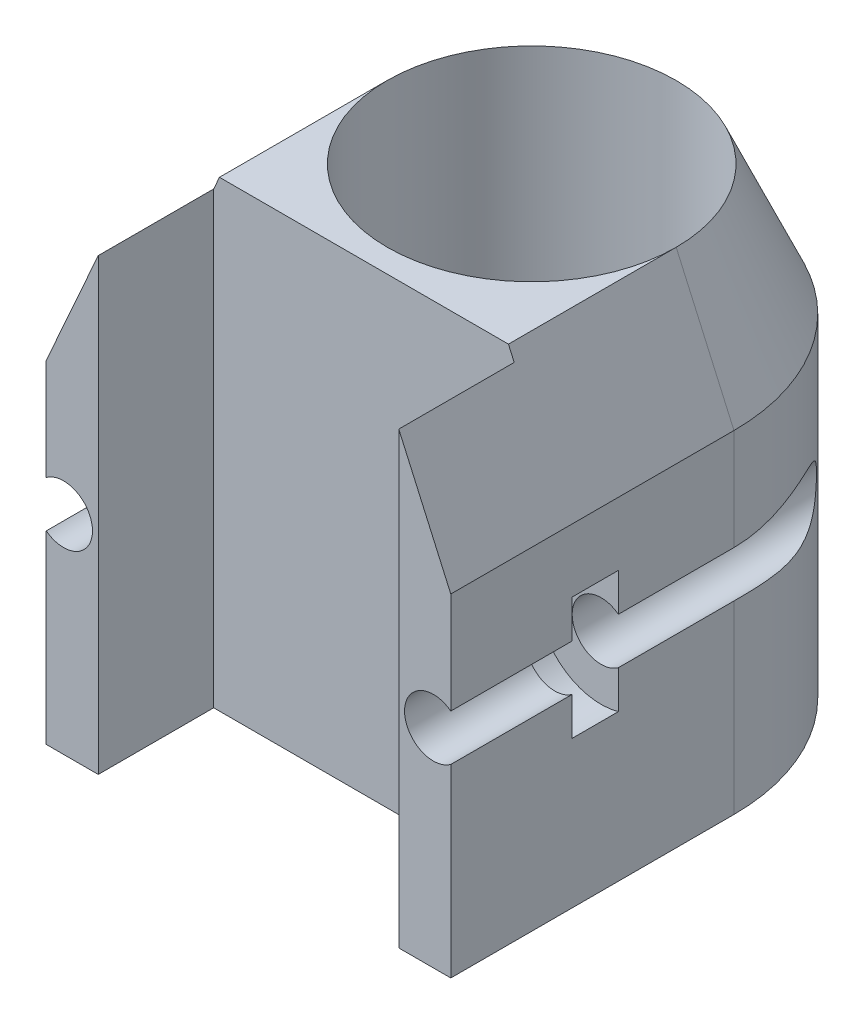
ISO-10303-21;
HEADER;
FILE_DESCRIPTION(('STEP AP214'),'2;1');
FILE_NAME('part.step','',(''),(''),'','','');
FILE_SCHEMA(('AUTOMOTIVE_DESIGN { 1 0 10303 214 1 1 1 1 }'));
ENDSEC;
DATA;
#1=APPLICATION_CONTEXT('core data for automotive mechanical design processes');
#2=APPLICATION_PROTOCOL_DEFINITION('international standard','automotive_design',2000,#1);
#3=PRODUCT_CONTEXT('',#1,'mechanical');
#4=PRODUCT('Part','Part','',(#3));
#5=PRODUCT_RELATED_PRODUCT_CATEGORY('part','',(#4));
#6=PRODUCT_DEFINITION_FORMATION('','',#4);
#7=PRODUCT_DEFINITION_CONTEXT('part definition',#1,'design');
#8=PRODUCT_DEFINITION('design','',#6,#7);
#9=PRODUCT_DEFINITION_SHAPE('','',#8);
#10=(LENGTH_UNIT() NAMED_UNIT(*) SI_UNIT(.MILLI.,.METRE.));
#11=(NAMED_UNIT(*) PLANE_ANGLE_UNIT() SI_UNIT($,.RADIAN.));
#12=(NAMED_UNIT(*) SI_UNIT($,.STERADIAN.) SOLID_ANGLE_UNIT());
#13=UNCERTAINTY_MEASURE_WITH_UNIT(LENGTH_MEASURE(1.E-05),#10,'distance_accuracy_value','');
#14=(GEOMETRIC_REPRESENTATION_CONTEXT(3) GLOBAL_UNCERTAINTY_ASSIGNED_CONTEXT((#13)) GLOBAL_UNIT_ASSIGNED_CONTEXT((#10,
#11,#12)) REPRESENTATION_CONTEXT('',''));
#15=CARTESIAN_POINT('',(0.,0.,0.));
#16=DIRECTION('',(0.,0.,1.));
#17=DIRECTION('',(1.,0.,0.));
#18=AXIS2_PLACEMENT_3D('',#15,#16,#17);
#19=CARTESIAN_POINT('',(17.5,0.,30.));
#20=DIRECTION('',(-1.,0.,0.));
#21=DIRECTION('',(0.,0.,1.));
#22=AXIS2_PLACEMENT_3D('',#19,#20,#21);
#23=PLANE('',#22);
#24=DIRECTION('',(0.,1.,0.));
#25=VECTOR('',#24,1.);
#26=CARTESIAN_POINT('',(17.5,0.,10.));
#27=LINE('',#26,#25);
#28=CARTESIAN_POINT('',(17.5,12.7084973778708,10.));
#29=VERTEX_POINT('',#28);
#30=CARTESIAN_POINT('',(17.5,16.,10.));
#31=VERTEX_POINT('',#30);
#32=EDGE_CURVE('E206',#29,#31,#27,.T.);
#33=ORIENTED_EDGE('',*,*,#32,.F.);
#34=DIRECTION('',(0.,0.,1.));
#35=VECTOR('',#34,1.);
#36=CARTESIAN_POINT('',(17.5,12.7084973778708,10.));
#37=LINE('',#36,#35);
#38=CARTESIAN_POINT('',(17.5,12.7084973778708,14.));
#39=VERTEX_POINT('',#38);
#40=EDGE_CURVE('E208',#39,#29,#37,.F.);
#41=ORIENTED_EDGE('',*,*,#40,.F.);
#42=DIRECTION('',(0.,1.,0.));
#43=VECTOR('',#42,1.);
#44=CARTESIAN_POINT('',(17.5,0.,14.));
#45=LINE('',#44,#43);
#46=CARTESIAN_POINT('',(17.5,16.,14.));
#47=VERTEX_POINT('',#46);
#48=EDGE_CURVE('E193',#39,#47,#45,.T.);
#49=ORIENTED_EDGE('',*,*,#48,.T.);
#50=DIRECTION('',(0.,0.,1.));
#51=VECTOR('',#50,1.);
#52=CARTESIAN_POINT('',(17.5,16.,-25.));
#53=LINE('',#52,#51);
#54=CARTESIAN_POINT('',(17.5,16.,24.5));
#55=VERTEX_POINT('',#54);
#56=EDGE_CURVE('E404',#47,#55,#53,.T.);
#57=ORIENTED_EDGE('',*,*,#56,.T.);
#58=DIRECTION('',(0.,-1.,0.));
#59=VECTOR('',#58,1.);
#60=CARTESIAN_POINT('',(17.5,0.,24.5));
#61=LINE('',#60,#59);
#62=CARTESIAN_POINT('',(17.5,0.,24.5));
#63=VERTEX_POINT('',#62);
#64=EDGE_CURVE('E235',#55,#63,#61,.T.);
#65=ORIENTED_EDGE('',*,*,#64,.T.);
#66=DIRECTION('',(0.,0.,-1.));
#67=VECTOR('',#66,1.);
#68=CARTESIAN_POINT('',(17.5,0.,30.));
#69=LINE('',#68,#67);
#70=CARTESIAN_POINT('',(17.5,0.,0.));
#71=VERTEX_POINT('',#70);
#72=EDGE_CURVE('E325',#63,#71,#69,.T.);
#73=ORIENTED_EDGE('',*,*,#72,.T.);
#74=DIRECTION('',(0.,1.,0.));
#75=VECTOR('',#74,1.);
#76=CARTESIAN_POINT('',(17.5,0.,0.));
#77=LINE('',#76,#75);
#78=CARTESIAN_POINT('',(17.5,16.,0.));
#79=VERTEX_POINT('',#78);
#80=EDGE_CURVE('E417',#71,#79,#77,.T.);
#81=ORIENTED_EDGE('',*,*,#80,.T.);
#82=EDGE_CURVE('E405',#79,#31,#53,.T.);
#83=ORIENTED_EDGE('',*,*,#82,.T.);
#84=EDGE_LOOP('',(#33,#41,#49,#57,#65,#73,#81,#83));
#85=FACE_BOUND('',#84,.T.);
#86=ADVANCED_FACE('F33',(#85),#23,.F.);
#87=DIRECTION('',(0.,1.,0.));
#88=VECTOR('',#87,1.);
#89=CARTESIAN_POINT('',(17.5,0.,10.));
#90=LINE('',#89,#88);
#91=CARTESIAN_POINT('',(17.5,20.,10.));
#92=VERTEX_POINT('',#91);
#93=CARTESIAN_POINT('',(17.5,23.2915026221292,10.));
#94=VERTEX_POINT('',#93);
#95=EDGE_CURVE('E201',#92,#94,#90,.T.);
#96=ORIENTED_EDGE('',*,*,#95,.F.);
#97=DIRECTION('',(0.,0.,1.));
#98=VECTOR('',#97,1.);
#99=CARTESIAN_POINT('',(17.5,20.,-25.));
#100=LINE('',#99,#98);
#101=CARTESIAN_POINT('',(17.5,20.,0.));
#102=VERTEX_POINT('',#101);
#103=EDGE_CURVE('E392',#92,#102,#100,.F.);
#104=ORIENTED_EDGE('',*,*,#103,.T.);
#105=CARTESIAN_POINT('',(17.5,28.7698161304786,0.));
#106=VERTEX_POINT('',#105);
#107=EDGE_CURVE('E414',#102,#106,#77,.T.);
#108=ORIENTED_EDGE('',*,*,#107,.T.);
#109=DIRECTION('',(0.,0.,1.));
#110=VECTOR('',#109,1.);
#111=CARTESIAN_POINT('',(17.5,28.7698161304786,30.));
#112=LINE('',#111,#110);
#113=CARTESIAN_POINT('',(17.5,28.7698161304786,24.5));
#114=VERTEX_POINT('',#113);
#115=EDGE_CURVE('E359',#106,#114,#112,.T.);
#116=ORIENTED_EDGE('',*,*,#115,.T.);
#117=DIRECTION('',(0.,-1.,0.));
#118=VECTOR('',#117,1.);
#119=CARTESIAN_POINT('',(17.5,0.,24.5));
#120=LINE('',#119,#118);
#121=CARTESIAN_POINT('',(17.5,20.,24.5));
#122=VERTEX_POINT('',#121);
#123=EDGE_CURVE('E230',#114,#122,#120,.T.);
#124=ORIENTED_EDGE('',*,*,#123,.T.);
#125=CARTESIAN_POINT('',(17.5,20.,14.));
#126=VERTEX_POINT('',#125);
#127=EDGE_CURVE('E199',#122,#126,#100,.F.);
#128=ORIENTED_EDGE('',*,*,#127,.T.);
#129=DIRECTION('',(0.,1.,0.));
#130=VECTOR('',#129,1.);
#131=CARTESIAN_POINT('',(17.5,0.,14.));
#132=LINE('',#131,#130);
#133=CARTESIAN_POINT('',(17.5,23.2915026221292,14.));
#134=VERTEX_POINT('',#133);
#135=EDGE_CURVE('E48',#126,#134,#132,.T.);
#136=ORIENTED_EDGE('',*,*,#135,.T.);
#137=DIRECTION('',(0.,0.,1.));
#138=VECTOR('',#137,1.);
#139=CARTESIAN_POINT('',(17.5,23.2915026221292,10.));
#140=LINE('',#139,#138);
#141=EDGE_CURVE('E11',#94,#134,#140,.T.);
#142=ORIENTED_EDGE('',*,*,#141,.F.);
#143=EDGE_LOOP('',(#96,#104,#108,#116,#124,#128,#136,#142));
#144=FACE_BOUND('',#143,.T.);
#145=ADVANCED_FACE('F196',(#144),#23,.F.);
#146=CARTESIAN_POINT('',(16.,18.,-25.));
#147=DIRECTION('',(0.,0.,1.));
#148=DIRECTION('',(1.,0.,0.));
#149=AXIS2_PLACEMENT_3D('',#146,#147,#148);
#150=CYLINDRICAL_SURFACE('',#149,2.5);
#151=CARTESIAN_POINT('',(16.,18.,10.));
#152=DIRECTION('',(0.,0.,1.));
#153=DIRECTION('',(1.,0.,0.));
#154=AXIS2_PLACEMENT_3D('',#151,#152,#153);
#155=CIRCLE('',#154,2.5);
#156=EDGE_CURVE('E41',#31,#92,#155,.F.);
#157=ORIENTED_EDGE('',*,*,#156,.F.);
#158=ORIENTED_EDGE('',*,*,#82,.F.);
#159=CARTESIAN_POINT('',(17.5,20.,0.));
#160=CARTESIAN_POINT('',(17.5000001349185,19.9999966583404,-0.104036701747004));
#161=CARTESIAN_POINT('',(17.4990722116674,20.0006962211482,-0.208069840767241));
#162=CARTESIAN_POINT('',(17.4953621135912,20.0034719912361,-0.416082588676481));
#163=CARTESIAN_POINT('',(17.492579977142,20.0055481700248,-0.520062198628784));
#164=CARTESIAN_POINT('',(17.4814573068199,20.0137962098175,-0.83179258471654));
#165=CARTESIAN_POINT('',(17.4703405093859,20.0219876088846,-1.03940004317038));
#166=CARTESIAN_POINT('',(17.4407607070393,20.0431679498784,-1.453592515381));
#167=CARTESIAN_POINT('',(17.4223061317233,20.0561513855178,-1.66017842792658));
#168=CARTESIAN_POINT('',(17.378105771415,20.0860332038702,-2.07229144767627));
#169=CARTESIAN_POINT('',(17.352359542209,20.1029318250882,-2.27781848959614));
#170=CARTESIAN_POINT('',(17.2932928182799,20.1397705834471,-2.68995548522975));
#171=CARTESIAN_POINT('',(17.2598879986332,20.1597437008973,-2.89655038308538));
#172=CARTESIAN_POINT('',(17.1857305541779,20.2013284029783,-3.30823506964464));
#173=CARTESIAN_POINT('',(17.1449778603509,20.2229400029982,-3.51332484419186));
#174=CARTESIAN_POINT('',(17.0117479682284,20.2882682504599,-4.12616155469434));
#175=CARTESIAN_POINT('',(16.908288643656,20.3324856611787,-4.53154776951602));
#176=CARTESIAN_POINT('',(16.7110070657937,20.3982174678684,-5.20301800335518));
#177=CARTESIAN_POINT('',(16.6251421221323,20.4224226966438,-5.47120680919474));
#178=CARTESIAN_POINT('',(16.4403328533076,20.4627347304597,-6.0037382732742));
#179=CARTESIAN_POINT('',(16.3413876027649,20.4788409621408,-6.26808065792502));
#180=CARTESIAN_POINT('',(16.1312794641152,20.4987675185581,-6.79047580903875));
#181=CARTESIAN_POINT('',(16.0201970165562,20.5026641943832,-7.04855760743155));
#182=CARTESIAN_POINT('',(15.7858892689778,20.4935741371551,-7.55873082248977));
#183=CARTESIAN_POINT('',(15.6626726774893,20.4805994320421,-7.81082637644844));
#184=CARTESIAN_POINT('',(15.4167176867694,20.4339314880849,-8.28489208156186));
#185=CARTESIAN_POINT('',(15.2949356355318,20.4022094258413,-8.5075306089698));
#186=CARTESIAN_POINT('',(15.1066107203799,20.3358685172449,-8.83494778832424));
#187=CARTESIAN_POINT('',(15.0427712018776,20.3105647015972,-8.94318964573963));
#188=CARTESIAN_POINT('',(14.9136548781851,20.2527461176608,-9.15688042350912));
#189=CARTESIAN_POINT('',(14.8483781337598,20.220231653708,-9.262329461528));
#190=CARTESIAN_POINT('',(14.7158979388157,20.1463746220114,-9.47142574198648));
#191=CARTESIAN_POINT('',(14.6486803425364,20.1049006579814,-9.5750181725665));
#192=CARTESIAN_POINT('',(14.5141222474948,20.012174864926,-9.77778382328739));
#193=CARTESIAN_POINT('',(14.4467817073161,19.9609186874695,-9.87695505382116));
#194=CARTESIAN_POINT('',(14.3135626830833,19.8475759950597,-10.0690368000539));
#195=CARTESIAN_POINT('',(14.2476782015196,19.7855504909686,-10.1619787014251));
#196=CARTESIAN_POINT('',(14.1187530310879,19.6491515398095,-10.3403523661797));
#197=CARTESIAN_POINT('',(14.0557082437364,19.5747966643985,-10.4257951338269));
#198=CARTESIAN_POINT('',(13.9403619067743,19.4199713290507,-10.5794456812424));
#199=CARTESIAN_POINT('',(13.8876063780179,19.3407100053055,-10.6485171363955));
#200=CARTESIAN_POINT('',(13.7886877183612,19.1703788537371,-10.7762989676296));
#201=CARTESIAN_POINT('',(13.7425252146353,19.0793079040702,-10.8350083581242));
#202=CARTESIAN_POINT('',(13.6593168727258,18.8846027050838,-10.9397258806229));
#203=CARTESIAN_POINT('',(13.6223810200207,18.7808370117646,-10.9855815107997));
#204=CARTESIAN_POINT('',(13.5617942431712,18.5637195390424,-11.0602937292252));
#205=CARTESIAN_POINT('',(13.5381216720758,18.4503837290013,-11.0891780201064));
#206=CARTESIAN_POINT('',(13.5088849691236,18.2337914174906,-11.1247690004805));
#207=CARTESIAN_POINT('',(13.5013267030213,18.131206757731,-11.1339198448082));
#208=CARTESIAN_POINT('',(13.4989970543622,17.9256921700422,-11.1367450978407));
#209=CARTESIAN_POINT('',(13.5042197902251,17.8227624226849,-11.130426625238));
#210=CARTESIAN_POINT('',(13.5254880258061,17.6328622559801,-11.1045662411206));
#211=CARTESIAN_POINT('',(13.5401236961017,17.5454857656249,-11.086745934486));
#212=CARTESIAN_POINT('',(13.5777060398346,17.3754342949404,-11.040687500343));
#213=CARTESIAN_POINT('',(13.6006544621609,17.2927603081912,-11.0124471805835));
#214=CARTESIAN_POINT('',(13.6620955495544,17.1074872222596,-10.9361891272966));
#215=CARTESIAN_POINT('',(13.7032167972818,17.0071803215394,-10.8847251639362));
#216=CARTESIAN_POINT('',(13.7942539996385,16.8186000553915,-10.7691220667369));
#217=CARTESIAN_POINT('',(13.8441863272334,16.7303496449201,-10.7049593082167));
#218=CARTESIAN_POINT('',(13.9725423664133,16.530671789883,-10.537237382894));
#219=CARTESIAN_POINT('',(14.0540060701347,16.4255182322951,-10.4285783366833));
#220=CARTESIAN_POINT('',(14.2225889193988,16.2373789299745,-10.1974774248338));
#221=CARTESIAN_POINT('',(14.3097187425488,16.1544366400306,-10.0750091978263));
#222=CARTESIAN_POINT('',(14.4699898820524,16.0206257373365,-9.84305044912465));
#223=CARTESIAN_POINT('',(14.5428705543899,15.9666774856238,-9.73511214483262));
#224=CARTESIAN_POINT('',(14.6883857185438,15.8699034649073,-9.51413866426798));
#225=CARTESIAN_POINT('',(14.7610200154238,15.8270850834616,-9.40110016080118));
#226=CARTESIAN_POINT('',(14.9050926145882,15.7510409081947,-9.17096923045799));
#227=CARTESIAN_POINT('',(14.9765295322297,15.7178255833414,-9.05387253397708));
#228=CARTESIAN_POINT('',(15.1174976789403,15.659700216836,-8.81648074232993));
#229=CARTESIAN_POINT('',(15.1870281757962,15.6347933263649,-8.6961844522729));
#230=CARTESIAN_POINT('',(15.3197345029758,15.5933873434762,-8.46008251038834));
#231=CARTESIAN_POINT('',(15.3830448294545,15.5764838271318,-8.3444220375553));
#232=CARTESIAN_POINT('',(15.5073049894279,15.5482032112337,-8.11116327783492));
#233=CARTESIAN_POINT('',(15.5682543865704,15.5368271288301,-7.99356463840249));
#234=CARTESIAN_POINT('',(15.7473429710268,15.509863210149,-7.63816321982876));
#235=CARTESIAN_POINT('',(15.8616586037815,15.501458018718,-7.39786858950536));
#236=CARTESIAN_POINT('',(16.0797792928233,15.4988849309453,-6.91102892797191));
#237=CARTESIAN_POINT('',(16.183523070867,15.5047956086261,-6.66445678478394));
#238=CARTESIAN_POINT('',(16.3794343976737,15.5269975825383,-6.16729293631431));
#239=CARTESIAN_POINT('',(16.4716036687891,15.5432873321083,-5.91670183534978));
#240=CARTESIAN_POINT('',(16.6363688796622,15.5810113767337,-5.43507071175561));
#241=CARTESIAN_POINT('',(16.7099828824276,15.6018422059095,-5.20432802575573));
#242=CARTESIAN_POINT('',(16.8475043584543,15.64692284989,-4.74027101487706));
#243=CARTESIAN_POINT('',(16.9114104974868,15.6711731337761,-4.50695634122738));
#244=CARTESIAN_POINT('',(17.0294961599903,15.72091179029,-4.0379166993228));
#245=CARTESIAN_POINT('',(17.0836719015325,15.7464006394436,-3.80219083136691));
#246=CARTESIAN_POINT('',(17.1822247753837,15.7965025191795,-3.32861031065927));
#247=CARTESIAN_POINT('',(17.2266021456003,15.8211155710142,-3.09075570973984));
#248=CARTESIAN_POINT('',(17.3048312870108,15.867058216798,-2.61714423710122));
#249=CARTESIAN_POINT('',(17.3388474864166,15.8884360595518,-2.38141933605158));
#250=CARTESIAN_POINT('',(17.3972606480938,15.9266251982784,-1.90842817504115));
#251=CARTESIAN_POINT('',(17.421658551437,15.9434369409568,-1.67116206818492));
#252=CARTESIAN_POINT('',(17.4607666075089,15.9710245124615,-1.19526690270277));
#253=CARTESIAN_POINT('',(17.4754689084798,15.981795448228,-0.956636896896107));
#254=CARTESIAN_POINT('',(17.4901821287962,15.9926660183677,-0.598199884218871));
#255=CARTESIAN_POINT('',(17.4938631654789,15.9954085926282,-0.47861034140202));
#256=CARTESIAN_POINT('',(17.49877226476,15.9990785581129,-0.23934902127463));
#257=CARTESIAN_POINT('',(17.5000002413907,16.0000058857215,-0.1196772412291));
#258=CARTESIAN_POINT('',(17.5,16.,0.));
#259=B_SPLINE_CURVE_WITH_KNOTS('',3,(#159,#160,#161,#162,#163,#164,#165,#166,#167,#168,#169,
#170,#171,#172,#173,#174,#175,#176,#177,#178,#179,#180,#181,#182,#183,#184,#185,#186,#187,#188,
#189,#190,#191,#192,#193,#194,#195,#196,#197,#198,#199,#200,#201,#202,#203,#204,#205,#206,#207,
#208,#209,#210,#211,#212,#213,#214,#215,#216,#217,#218,#219,#220,#221,#222,#223,#224,#225,#226,
#227,#228,#229,#230,#231,#232,#233,#234,#235,#236,#237,#238,#239,#240,#241,#242,#243,#244,#245,
#246,#247,#248,#249,#250,#251,#252,#253,#254,#255,#256,#257,#258),.UNSPECIFIED.,.F.,.F.,(4,2,2,
2,2,2,2,2,2,2,2,2,2,2,2,2,2,2,2,2,2,2,2,2,2,2,2,2,2,2,2,2,2,2,2,2,2,2,2,2,2,2,2,2,2,2,2,2,2,4),
(0.,0.312096657146084,0.624186855136378,1.24817204726987,1.87144247039534,2.49475087185122,
3.12528320581323,3.75582146265863,5.01667946406824,5.86424244105709,6.71186541186497,
7.5541771791628,8.39588877489218,9.16179472294351,9.54616330463849,9.93051566658765,
10.3209422325102,10.7115427584641,11.0999986323561,11.4878746060888,11.8397308120868,
12.1916204668315,12.5475236087374,12.9028441776861,13.2107729637197,13.5185600732784,
13.7884991632999,14.0584950778171,14.4165217730039,14.7752209059652,15.2876321200243,
15.8010386255903,16.2233618616991,16.6459647071821,17.0690265393981,17.4922486464145,
17.8908810264079,18.2895867343784,19.0873917984768,19.8895856056375,20.6916598999882,
21.4207042104739,22.1498486288209,22.8792758344541,23.6086853273998,24.3258307921385,
25.0429060726195,25.7605613490251,26.1195600133014,26.4785712584831),.UNSPECIFIED.);
#260=EDGE_CURVE('E395',#102,#79,#259,.T.);
#261=ORIENTED_EDGE('',*,*,#260,.F.);
#262=ORIENTED_EDGE('',*,*,#103,.F.);
#263=EDGE_LOOP('',(#157,#158,#261,#262));
#264=FACE_BOUND('',#263,.T.);
#265=ADVANCED_FACE('F304',(#264),#150,.F.);
#266=CARTESIAN_POINT('',(-17.5,0.,30.));
#267=DIRECTION('',(1.,0.,0.));
#268=DIRECTION('',(0.,0.,-1.));
#269=AXIS2_PLACEMENT_3D('',#266,#267,#268);
#270=PLANE('',#269);
#271=DIRECTION('',(0.,-1.,0.));
#272=VECTOR('',#271,1.);
#273=CARTESIAN_POINT('',(-17.5,0.,10.));
#274=LINE('',#273,#272);
#275=CARTESIAN_POINT('',(-17.5,23.2915026221292,10.));
#276=VERTEX_POINT('',#275);
#277=CARTESIAN_POINT('',(-17.5,20.,10.));
#278=VERTEX_POINT('',#277);
#279=EDGE_CURVE('E222',#276,#278,#274,.T.);
#280=ORIENTED_EDGE('',*,*,#279,.F.);
#281=DIRECTION('',(0.,0.,1.));
#282=VECTOR('',#281,1.);
#283=CARTESIAN_POINT('',(-17.5,23.2915026221292,10.));
#284=LINE('',#283,#282);
#285=CARTESIAN_POINT('',(-17.5,23.2915026221292,14.));
#286=VERTEX_POINT('',#285);
#287=EDGE_CURVE('E224',#276,#286,#284,.T.);
#288=ORIENTED_EDGE('',*,*,#287,.T.);
#289=DIRECTION('',(0.,-1.,0.));
#290=VECTOR('',#289,1.);
#291=CARTESIAN_POINT('',(-17.5,0.,14.));
#292=LINE('',#291,#290);
#293=CARTESIAN_POINT('',(-17.5,20.,14.));
#294=VERTEX_POINT('',#293);
#295=EDGE_CURVE('E217',#286,#294,#292,.T.);
#296=ORIENTED_EDGE('',*,*,#295,.T.);
#297=DIRECTION('',(0.,0.,1.));
#298=VECTOR('',#297,1.);
#299=CARTESIAN_POINT('',(-17.5,20.,-25.));
#300=LINE('',#299,#298);
#301=CARTESIAN_POINT('',(-17.5,20.,24.5));
#302=VERTEX_POINT('',#301);
#303=EDGE_CURVE('E270',#294,#302,#300,.T.);
#304=ORIENTED_EDGE('',*,*,#303,.T.);
#305=DIRECTION('',(0.,1.,0.));
#306=VECTOR('',#305,1.);
#307=CARTESIAN_POINT('',(-17.5,0.,24.5));
#308=LINE('',#307,#306);
#309=CARTESIAN_POINT('',(-17.5,28.7698161304786,24.5));
#310=VERTEX_POINT('',#309);
#311=EDGE_CURVE('E247',#302,#310,#308,.T.);
#312=ORIENTED_EDGE('',*,*,#311,.T.);
#313=DIRECTION('',(0.,0.,-1.));
#314=VECTOR('',#313,1.);
#315=CARTESIAN_POINT('',(-17.5,28.7698161304786,0.));
#316=LINE('',#315,#314);
#317=CARTESIAN_POINT('',(-17.5,28.7698161304786,0.));
#318=VERTEX_POINT('',#317);
#319=EDGE_CURVE('E364',#310,#318,#316,.T.);
#320=ORIENTED_EDGE('',*,*,#319,.T.);
#321=DIRECTION('',(0.,-1.,0.));
#322=VECTOR('',#321,1.);
#323=CARTESIAN_POINT('',(-17.5,0.,0.));
#324=LINE('',#323,#322);
#325=CARTESIAN_POINT('',(-17.5,20.,0.));
#326=VERTEX_POINT('',#325);
#327=EDGE_CURVE('E421',#318,#326,#324,.T.);
#328=ORIENTED_EDGE('',*,*,#327,.T.);
#329=EDGE_CURVE('E271',#326,#278,#300,.T.);
#330=ORIENTED_EDGE('',*,*,#329,.T.);
#331=EDGE_LOOP('',(#280,#288,#296,#304,#312,#320,#328,#330));
#332=FACE_BOUND('',#331,.T.);
#333=ADVANCED_FACE('F300',(#332),#270,.F.);
#334=DIRECTION('',(0.,-1.,0.));
#335=VECTOR('',#334,1.);
#336=CARTESIAN_POINT('',(-17.5,0.,10.));
#337=LINE('',#336,#335);
#338=CARTESIAN_POINT('',(-17.5,16.,10.));
#339=VERTEX_POINT('',#338);
#340=CARTESIAN_POINT('',(-17.5,12.7084973778708,10.));
#341=VERTEX_POINT('',#340);
#342=EDGE_CURVE('E220',#339,#341,#337,.T.);
#343=ORIENTED_EDGE('',*,*,#342,.F.);
#344=DIRECTION('',(0.,0.,1.));
#345=VECTOR('',#344,1.);
#346=CARTESIAN_POINT('',(-17.5,16.,-25.));
#347=LINE('',#346,#345);
#348=CARTESIAN_POINT('',(-17.5,16.,0.));
#349=VERTEX_POINT('',#348);
#350=EDGE_CURVE('E261',#339,#349,#347,.F.);
#351=ORIENTED_EDGE('',*,*,#350,.T.);
#352=CARTESIAN_POINT('',(-17.5,0.,0.));
#353=VERTEX_POINT('',#352);
#354=EDGE_CURVE('E420',#349,#353,#324,.T.);
#355=ORIENTED_EDGE('',*,*,#354,.T.);
#356=DIRECTION('',(0.,0.,-1.));
#357=VECTOR('',#356,1.);
#358=CARTESIAN_POINT('',(-17.5,0.,30.));
#359=LINE('',#358,#357);
#360=CARTESIAN_POINT('',(-17.5,0.,24.5));
#361=VERTEX_POINT('',#360);
#362=EDGE_CURVE('E331',#361,#353,#359,.T.);
#363=ORIENTED_EDGE('',*,*,#362,.F.);
#364=DIRECTION('',(0.,1.,0.));
#365=VECTOR('',#364,1.);
#366=CARTESIAN_POINT('',(-17.5,0.,24.5));
#367=LINE('',#366,#365);
#368=CARTESIAN_POINT('',(-17.5,16.,24.5));
#369=VERTEX_POINT('',#368);
#370=EDGE_CURVE('E253',#361,#369,#367,.T.);
#371=ORIENTED_EDGE('',*,*,#370,.T.);
#372=CARTESIAN_POINT('',(-17.5,16.,14.));
#373=VERTEX_POINT('',#372);
#374=EDGE_CURVE('E257',#369,#373,#347,.F.);
#375=ORIENTED_EDGE('',*,*,#374,.T.);
#376=DIRECTION('',(0.,-1.,0.));
#377=VECTOR('',#376,1.);
#378=CARTESIAN_POINT('',(-17.5,0.,14.));
#379=LINE('',#378,#377);
#380=CARTESIAN_POINT('',(-17.5,12.7084973778708,14.));
#381=VERTEX_POINT('',#380);
#382=EDGE_CURVE('E56',#373,#381,#379,.T.);
#383=ORIENTED_EDGE('',*,*,#382,.T.);
#384=DIRECTION('',(0.,0.,1.));
#385=VECTOR('',#384,1.);
#386=CARTESIAN_POINT('',(-17.5,12.7084973778708,10.));
#387=LINE('',#386,#385);
#388=EDGE_CURVE('E380',#381,#341,#387,.F.);
#389=ORIENTED_EDGE('',*,*,#388,.T.);
#390=EDGE_LOOP('',(#343,#351,#355,#363,#371,#375,#383,#389));
#391=FACE_BOUND('',#390,.T.);
#392=ADVANCED_FACE('F303',(#391),#270,.F.);
#393=CARTESIAN_POINT('',(-16.,18.,-25.));
#394=DIRECTION('',(0.,0.,1.));
#395=DIRECTION('',(1.,0.,0.));
#396=AXIS2_PLACEMENT_3D('',#393,#394,#395);
#397=CYLINDRICAL_SURFACE('',#396,2.5);
#398=CARTESIAN_POINT('',(-16.,18.,10.));
#399=DIRECTION('',(0.,0.,1.));
#400=DIRECTION('',(1.,0.,0.));
#401=AXIS2_PLACEMENT_3D('',#398,#399,#400);
#402=CIRCLE('',#401,2.5);
#403=EDGE_CURVE('E378',#278,#339,#402,.F.);
#404=ORIENTED_EDGE('',*,*,#403,.F.);
#405=ORIENTED_EDGE('',*,*,#329,.F.);
#406=CARTESIAN_POINT('',(-17.5,16.,0.));
#407=CARTESIAN_POINT('',(-17.5000001349185,16.0000033416596,-0.104036701747));
#408=CARTESIAN_POINT('',(-17.4990722116674,15.9993037788518,-0.208069840767237));
#409=CARTESIAN_POINT('',(-17.4953621135912,15.9965280087639,-0.416082588676478));
#410=CARTESIAN_POINT('',(-17.492579977142,15.9944518299752,-0.520062198628782));
#411=CARTESIAN_POINT('',(-17.4814573068199,15.9862037901825,-0.831792584716539));
#412=CARTESIAN_POINT('',(-17.4703405093859,15.9780123911154,-1.03940004317038));
#413=CARTESIAN_POINT('',(-17.4407607070393,15.9568320501216,-1.45359251538101));
#414=CARTESIAN_POINT('',(-17.4223061317233,15.9438486144822,-1.66017842792658));
#415=CARTESIAN_POINT('',(-17.378105771415,15.9139667961298,-2.07229144767627));
#416=CARTESIAN_POINT('',(-17.352359542209,15.8970681749118,-2.27781848959615));
#417=CARTESIAN_POINT('',(-17.2932928182799,15.8602294165529,-2.68995548522975));
#418=CARTESIAN_POINT('',(-17.2598879986332,15.8402562991027,-2.89655038308538));
#419=CARTESIAN_POINT('',(-17.1857305541779,15.7986715970217,-3.30823506964465));
#420=CARTESIAN_POINT('',(-17.1449778603509,15.7770599970018,-3.51332484419186));
#421=CARTESIAN_POINT('',(-17.0117479682284,15.7117317495401,-4.12616155469435));
#422=CARTESIAN_POINT('',(-16.908288643656,15.6675143388213,-4.53154776951602));
#423=CARTESIAN_POINT('',(-16.7110070657937,15.6017825321316,-5.20301800335519));
#424=CARTESIAN_POINT('',(-16.6251421221323,15.5775773033562,-5.47120680919474));
#425=CARTESIAN_POINT('',(-16.4403328533076,15.5372652695403,-6.0037382732742));
#426=CARTESIAN_POINT('',(-16.3413876027649,15.5211590378592,-6.26808065792502));
#427=CARTESIAN_POINT('',(-16.1312794641152,15.5012324814419,-6.79047580903874));
#428=CARTESIAN_POINT('',(-16.0201970165562,15.4973358056168,-7.04855760743154));
#429=CARTESIAN_POINT('',(-15.7858892689778,15.5064258628449,-7.55873082248976));
#430=CARTESIAN_POINT('',(-15.6626726774893,15.5194005679579,-7.81082637644842));
#431=CARTESIAN_POINT('',(-15.4167176867694,15.5660685119151,-8.28489208156185));
#432=CARTESIAN_POINT('',(-15.2949356355318,15.5977905741587,-8.50753060896978));
#433=CARTESIAN_POINT('',(-15.10661072038,15.6641314827551,-8.83494778832423));
#434=CARTESIAN_POINT('',(-15.0427712018776,15.6894352984028,-8.94318964573962));
#435=CARTESIAN_POINT('',(-14.9136548781851,15.7472538823392,-9.15688042350911));
#436=CARTESIAN_POINT('',(-14.8483781337598,15.7797683462921,-9.26232946152799));
#437=CARTESIAN_POINT('',(-14.7158979388157,15.8536253779886,-9.47142574198648));
#438=CARTESIAN_POINT('',(-14.6486803425364,15.8950993420187,-9.5750181725665));
#439=CARTESIAN_POINT('',(-14.5141222474948,15.9878251350741,-9.7777838232874));
#440=CARTESIAN_POINT('',(-14.4467817073161,16.0390813125305,-9.87695505382116));
#441=CARTESIAN_POINT('',(-14.3135626830833,16.1524240049403,-10.0690368000539));
#442=CARTESIAN_POINT('',(-14.2476782015196,16.2144495090314,-10.1619787014251));
#443=CARTESIAN_POINT('',(-14.1187530310879,16.3508484601905,-10.3403523661797));
#444=CARTESIAN_POINT('',(-14.0557082437364,16.4252033356015,-10.4257951338269));
#445=CARTESIAN_POINT('',(-13.9403619067743,16.5800286709494,-10.5794456812424));
#446=CARTESIAN_POINT('',(-13.8876063780179,16.6592899946945,-10.6485171363955));
#447=CARTESIAN_POINT('',(-13.7886877183612,16.8296211462629,-10.7762989676296));
#448=CARTESIAN_POINT('',(-13.7425252146353,16.9206920959298,-10.8350083581242));
#449=CARTESIAN_POINT('',(-13.6593168727258,17.1153972949162,-10.9397258806229));
#450=CARTESIAN_POINT('',(-13.6223810200207,17.2191629882354,-10.9855815107997));
#451=CARTESIAN_POINT('',(-13.5617942431712,17.4362804609576,-11.0602937292252));
#452=CARTESIAN_POINT('',(-13.5381216720758,17.5496162709987,-11.0891780201064));
#453=CARTESIAN_POINT('',(-13.5088849691236,17.7662085825094,-11.1247690004804));
#454=CARTESIAN_POINT('',(-13.5013267030213,17.868793242269,-11.1339198448081));
#455=CARTESIAN_POINT('',(-13.4989970543622,18.0743078299579,-11.1367450978407));
#456=CARTESIAN_POINT('',(-13.5042197902251,18.1772375773151,-11.130426625238));
#457=CARTESIAN_POINT('',(-13.5254880258061,18.3671377440199,-11.1045662411206));
#458=CARTESIAN_POINT('',(-13.5401236961017,18.4545142343751,-11.086745934486));
#459=CARTESIAN_POINT('',(-13.5777060398346,18.6245657050597,-11.040687500343));
#460=CARTESIAN_POINT('',(-13.6006544621609,18.7072396918088,-11.0124471805835));
#461=CARTESIAN_POINT('',(-13.6620955495544,18.8925127777404,-10.9361891272965));
#462=CARTESIAN_POINT('',(-13.7032167972818,18.9928196784606,-10.8847251639361));
#463=CARTESIAN_POINT('',(-13.7942539996385,19.1813999446085,-10.7691220667369));
#464=CARTESIAN_POINT('',(-13.8441863272335,19.26965035508,-10.7049593082166));
#465=CARTESIAN_POINT('',(-13.9725423664133,19.469328210117,-10.537237382894));
#466=CARTESIAN_POINT('',(-14.0540060701347,19.5744817677049,-10.4285783366833));
#467=CARTESIAN_POINT('',(-14.2225889193989,19.7626210700256,-10.1974774248337));
#468=CARTESIAN_POINT('',(-14.3097187425488,19.8455633599694,-10.0750091978262));
#469=CARTESIAN_POINT('',(-14.4699898820525,19.9793742626636,-9.84305044912461));
#470=CARTESIAN_POINT('',(-14.5428705543899,20.0333225143762,-9.73511214483258));
#471=CARTESIAN_POINT('',(-14.6883857185438,20.1300965350927,-9.51413866426793));
#472=CARTESIAN_POINT('',(-14.7610200154238,20.1729149165384,-9.40110016080113));
#473=CARTESIAN_POINT('',(-14.9050926145883,20.2489590918053,-9.17096923045794));
#474=CARTESIAN_POINT('',(-14.9765295322297,20.2821744166586,-9.05387253397703));
#475=CARTESIAN_POINT('',(-15.1174976789403,20.3402997831641,-8.81648074232988));
#476=CARTESIAN_POINT('',(-15.1870281757962,20.3652066736351,-8.69618445227285));
#477=CARTESIAN_POINT('',(-15.3197345029758,20.4066126565238,-8.46008251038828));
#478=CARTESIAN_POINT('',(-15.3830448294545,20.4235161728682,-8.34442203755524));
#479=CARTESIAN_POINT('',(-15.507304989428,20.4517967887663,-8.11116327783485));
#480=CARTESIAN_POINT('',(-15.5682543865704,20.46317287117,-7.99356463840242));
#481=CARTESIAN_POINT('',(-15.7473429710268,20.490136789851,-7.63816321982868));
#482=CARTESIAN_POINT('',(-15.8616586037816,20.4985419812821,-7.39786858950527));
#483=CARTESIAN_POINT('',(-16.0797792928234,20.5011150690547,-6.91102892797181));
#484=CARTESIAN_POINT('',(-16.1835230708671,20.4952043913739,-6.66445678478384));
#485=CARTESIAN_POINT('',(-16.3794343976737,20.4730024174617,-6.1672929363142));
#486=CARTESIAN_POINT('',(-16.4716036687892,20.4567126678917,-5.91670183534966));
#487=CARTESIAN_POINT('',(-16.6363688796622,20.4189886232663,-5.43507071175548));
#488=CARTESIAN_POINT('',(-16.7099828824276,20.3981577940905,-5.20432802575561));
#489=CARTESIAN_POINT('',(-16.8475043584543,20.35307715011,-4.74027101487696));
#490=CARTESIAN_POINT('',(-16.9114104974869,20.3288268662239,-4.50695634122727));
#491=CARTESIAN_POINT('',(-17.0294961599903,20.2790882097101,-4.03791669932271));
#492=CARTESIAN_POINT('',(-17.0836719015325,20.2535993605564,-3.80219083136682));
#493=CARTESIAN_POINT('',(-17.1822247753837,20.2034974808205,-3.32861031065919));
#494=CARTESIAN_POINT('',(-17.2266021456003,20.1788844289858,-3.09075570973976));
#495=CARTESIAN_POINT('',(-17.3048312870108,20.1329417832021,-2.61714423710115));
#496=CARTESIAN_POINT('',(-17.3388474864166,20.1115639404482,-2.38141933605152));
#497=CARTESIAN_POINT('',(-17.3972606480938,20.0733748017216,-1.9084281750411));
#498=CARTESIAN_POINT('',(-17.421658551437,20.0565630590432,-1.67116206818487));
#499=CARTESIAN_POINT('',(-17.4607666075089,20.0289754875385,-1.19526690270273));
#500=CARTESIAN_POINT('',(-17.4754689084798,20.018204551772,-0.95663689689608));
#501=CARTESIAN_POINT('',(-17.4901821287962,20.0073339816323,-0.598199884218852));
#502=CARTESIAN_POINT('',(-17.4938631654789,20.0045914073718,-0.478610341402004));
#503=CARTESIAN_POINT('',(-17.49877226476,20.0009214418871,-0.239349021274621));
#504=CARTESIAN_POINT('',(-17.5000002413907,19.9999941142785,-0.119677241229094));
#505=CARTESIAN_POINT('',(-17.5,20.,0.));
#506=B_SPLINE_CURVE_WITH_KNOTS('',3,(#406,#407,#408,#409,#410,#411,#412,#413,#414,#415,#416,
#417,#418,#419,#420,#421,#422,#423,#424,#425,#426,#427,#428,#429,#430,#431,#432,#433,#434,#435,
#436,#437,#438,#439,#440,#441,#442,#443,#444,#445,#446,#447,#448,#449,#450,#451,#452,#453,#454,
#455,#456,#457,#458,#459,#460,#461,#462,#463,#464,#465,#466,#467,#468,#469,#470,#471,#472,#473,
#474,#475,#476,#477,#478,#479,#480,#481,#482,#483,#484,#485,#486,#487,#488,#489,#490,#491,#492,
#493,#494,#495,#496,#497,#498,#499,#500,#501,#502,#503,#504,#505),.UNSPECIFIED.,.F.,.F.,(4,2,2,
2,2,2,2,2,2,2,2,2,2,2,2,2,2,2,2,2,2,2,2,2,2,2,2,2,2,2,2,2,2,2,2,2,2,2,2,2,2,2,2,2,2,2,2,2,2,4),
(0.,0.312096657146085,0.624186855136381,1.24817204726987,1.87144247039535,2.49475087185123,
3.12528320581324,3.75582146265864,5.01667946406825,5.86424244105709,6.71186541186496,
7.55417717916279,8.39588877489216,9.1617947229435,9.54616330463849,9.93051566658766,
10.3209422325102,10.7115427584641,11.0999986323562,11.4878746060888,11.8397308120868,
12.1916204668316,12.5475236087375,12.9028441776861,13.2107729637197,13.5185600732784,
13.7884991632999,14.0584950778171,14.4165217730039,14.7752209059652,15.2876321200243,
15.8010386255903,16.2233618616991,16.6459647071822,17.0690265393981,17.4922486464145,
17.890881026408,18.2895867343784,19.0873917984768,19.8895856056376,20.6916598999883,
21.420704210474,22.149848628821,22.8792758344541,23.6086853273999,24.3258307921385,
25.0429060726196,25.7605613490251,26.1195600133014,26.478571258483),.UNSPECIFIED.);
#507=EDGE_CURVE('E260',#349,#326,#506,.T.);
#508=ORIENTED_EDGE('',*,*,#507,.F.);
#509=ORIENTED_EDGE('',*,*,#350,.F.);
#510=EDGE_LOOP('',(#404,#405,#508,#509));
#511=FACE_BOUND('',#510,.T.);
#512=ADVANCED_FACE('F285',(#511),#397,.F.);
#513=CARTESIAN_POINT('',(0.,40.,0.));
#514=DIRECTION('',(0.,1.,0.));
#515=DIRECTION('',(0.,0.,1.));
#516=AXIS2_PLACEMENT_3D('',#513,#514,#515);
#517=PLANE('',#516);
#518=DIRECTION('',(-1.,0.,0.));
#519=VECTOR('',#518,1.);
#520=CARTESIAN_POINT('',(-13.,40.,14.512798853972));
#521=LINE('',#520,#519);
#522=CARTESIAN_POINT('',(12.4999999999999,40.,14.512798853972));
#523=VERTEX_POINT('',#522);
#524=CARTESIAN_POINT('',(-12.4999999999999,40.,14.512798853972));
#525=VERTEX_POINT('',#524);
#526=EDGE_CURVE('E407',#523,#525,#521,.T.);
#527=ORIENTED_EDGE('',*,*,#526,.F.);
#528=DIRECTION('',(0.,0.,-1.));
#529=VECTOR('',#528,1.);
#530=CARTESIAN_POINT('',(12.4999999999999,40.,0.));
#531=LINE('',#530,#529);
#532=CARTESIAN_POINT('',(12.5,40.,0.));
#533=VERTEX_POINT('',#532);
#534=EDGE_CURVE('E351',#523,#533,#531,.T.);
#535=ORIENTED_EDGE('',*,*,#534,.T.);
#536=CARTESIAN_POINT('',(0.,40.,0.));
#537=DIRECTION('',(0.,1.,0.));
#538=DIRECTION('',(0.,0.,1.));
#539=AXIS2_PLACEMENT_3D('',#536,#537,#538);
#540=CIRCLE('',#539,12.5);
#541=CARTESIAN_POINT('',(-12.4999999999999,40.,0.));
#542=VERTEX_POINT('',#541);
#543=EDGE_CURVE('E330',#542,#533,#540,.T.);
#544=ORIENTED_EDGE('',*,*,#543,.F.);
#545=DIRECTION('',(0.,0.,1.));
#546=VECTOR('',#545,1.);
#547=CARTESIAN_POINT('',(-12.4999999999999,40.,30.));
#548=LINE('',#547,#546);
#549=EDGE_CURVE('E349',#542,#525,#548,.T.);
#550=ORIENTED_EDGE('',*,*,#549,.T.);
#551=EDGE_LOOP('',(#527,#535,#544,#550));
#552=FACE_BOUND('',#551,.T.);
#553=ADVANCED_FACE('F312',(#552),#517,.T.);
#554=CARTESIAN_POINT('',(0.,0.,0.));
#555=DIRECTION('',(0.,1.,0.));
#556=DIRECTION('',(0.,0.,1.));
#557=AXIS2_PLACEMENT_3D('',#554,#555,#556);
#558=PLANE('',#557);
#559=ORIENTED_EDGE('',*,*,#72,.F.);
#560=DIRECTION('',(-1.,0.,0.));
#561=VECTOR('',#560,1.);
#562=CARTESIAN_POINT('',(0.,0.,24.5));
#563=LINE('',#562,#561);
#564=CARTESIAN_POINT('',(13.,0.,24.5));
#565=VERTEX_POINT('',#564);
#566=EDGE_CURVE('E232',#63,#565,#563,.T.);
#567=ORIENTED_EDGE('',*,*,#566,.T.);
#568=DIRECTION('',(0.,0.,-1.));
#569=VECTOR('',#568,1.);
#570=CARTESIAN_POINT('',(13.,0.,0.));
#571=LINE('',#570,#569);
#572=CARTESIAN_POINT('',(13.,0.,14.512798853972));
#573=VERTEX_POINT('',#572);
#574=EDGE_CURVE('E347',#565,#573,#571,.T.);
#575=ORIENTED_EDGE('',*,*,#574,.T.);
#576=DIRECTION('',(-1.,0.,0.));
#577=VECTOR('',#576,1.);
#578=CARTESIAN_POINT('',(0.,0.,14.512798853972));
#579=LINE('',#578,#577);
#580=CARTESIAN_POINT('',(-13.,0.,14.512798853972));
#581=VERTEX_POINT('',#580);
#582=EDGE_CURVE('E341',#573,#581,#579,.T.);
#583=ORIENTED_EDGE('',*,*,#582,.T.);
#584=DIRECTION('',(0.,0.,1.));
#585=VECTOR('',#584,1.);
#586=CARTESIAN_POINT('',(-13.,0.,0.));
#587=LINE('',#586,#585);
#588=CARTESIAN_POINT('',(-13.,0.,24.5));
#589=VERTEX_POINT('',#588);
#590=EDGE_CURVE('E344',#581,#589,#587,.T.);
#591=ORIENTED_EDGE('',*,*,#590,.T.);
#592=EDGE_CURVE('E236',#589,#361,#563,.T.);
#593=ORIENTED_EDGE('',*,*,#592,.T.);
#594=ORIENTED_EDGE('',*,*,#362,.T.);
#595=CARTESIAN_POINT('',(0.,0.,0.));
#596=DIRECTION('',(0.,1.,0.));
#597=DIRECTION('',(0.,0.,1.));
#598=AXIS2_PLACEMENT_3D('',#595,#596,#597);
#599=CIRCLE('',#598,17.5);
#600=EDGE_CURVE('E338',#71,#353,#599,.T.);
#601=ORIENTED_EDGE('',*,*,#600,.F.);
#602=EDGE_LOOP('',(#559,#567,#575,#583,#591,#593,#594,#601));
#603=FACE_BOUND('',#602,.T.);
#604=CARTESIAN_POINT('',(0.,0.,0.));
#605=DIRECTION('',(0.,1.,0.));
#606=DIRECTION('',(0.,0.,1.));
#607=AXIS2_PLACEMENT_3D('',#604,#605,#606);
#608=CIRCLE('',#607,12.5);
#609=CARTESIAN_POINT('',(0.,0.,12.5));
#610=VERTEX_POINT('',#609);
#611=EDGE_CURVE('E328',#610,#610,#608,.T.);
#612=ORIENTED_EDGE('',*,*,#611,.T.);
#613=EDGE_LOOP('',(#612));
#614=FACE_BOUND('',#613,.T.);
#615=ADVANCED_FACE('F314',(#603,#614),#558,.F.);
#616=CARTESIAN_POINT('',(0.,40.,0.));
#617=DIRECTION('',(0.,-1.,0.));
#618=DIRECTION('',(0.,0.,-1.));
#619=AXIS2_PLACEMENT_3D('',#616,#617,#618);
#620=CYLINDRICAL_SURFACE('',#619,17.5);
#621=ORIENTED_EDGE('',*,*,#327,.F.);
#622=CARTESIAN_POINT('',(0.,28.7698161304786,0.));
#623=DIRECTION('',(0.,1.,0.));
#624=DIRECTION('',(0.,0.,1.));
#625=AXIS2_PLACEMENT_3D('',#622,#623,#624);
#626=CIRCLE('',#625,17.5);
#627=EDGE_CURVE('E362',#318,#106,#626,.F.);
#628=ORIENTED_EDGE('',*,*,#627,.T.);
#629=ORIENTED_EDGE('',*,*,#107,.F.);
#630=ORIENTED_EDGE('',*,*,#260,.T.);
#631=ORIENTED_EDGE('',*,*,#80,.F.);
#632=ORIENTED_EDGE('',*,*,#600,.T.);
#633=ORIENTED_EDGE('',*,*,#354,.F.);
#634=ORIENTED_EDGE('',*,*,#507,.T.);
#635=EDGE_LOOP('',(#621,#628,#629,#630,#631,#632,#633,#634));
#636=FACE_BOUND('',#635,.T.);
#637=ADVANCED_FACE('F273',(#636),#620,.T.);
#638=CARTESIAN_POINT('',(0.,40.,0.));
#639=DIRECTION('',(0.,-1.,0.));
#640=DIRECTION('',(0.,0.,-1.));
#641=AXIS2_PLACEMENT_3D('',#638,#639,#640);
#642=CYLINDRICAL_SURFACE('',#641,12.5);
#643=EDGE_CURVE('E334',#533,#542,#540,.T.);
#644=ORIENTED_EDGE('',*,*,#643,.T.);
#645=ORIENTED_EDGE('',*,*,#543,.T.);
#646=EDGE_LOOP('',(#644,#645));
#647=FACE_BOUND('',#646,.T.);
#648=ORIENTED_EDGE('',*,*,#611,.F.);
#649=EDGE_LOOP('',(#648));
#650=FACE_BOUND('',#649,.T.);
#651=ADVANCED_FACE('F298',(#647,#650),#642,.F.);
#652=CARTESIAN_POINT('',(13.,-15.,24.512798853972));
#653=DIRECTION('',(1.,0.,0.));
#654=DIRECTION('',(0.,0.,-1.));
#655=AXIS2_PLACEMENT_3D('',#652,#653,#654);
#656=PLANE('',#655);
#657=ORIENTED_EDGE('',*,*,#574,.F.);
#658=DIRECTION('',(0.,1.,0.));
#659=VECTOR('',#658,1.);
#660=CARTESIAN_POINT('',(13.,-15.,24.5));
#661=LINE('',#660,#659);
#662=CARTESIAN_POINT('',(13.,38.8769816130477,24.5));
#663=VERTEX_POINT('',#662);
#664=EDGE_CURVE('E227',#565,#663,#661,.T.);
#665=ORIENTED_EDGE('',*,*,#664,.T.);
#666=DIRECTION('',(0.,0.,-1.));
#667=VECTOR('',#666,1.);
#668=CARTESIAN_POINT('',(13.,38.8769816130477,0.));
#669=LINE('',#668,#667);
#670=CARTESIAN_POINT('',(13.,38.8769816130477,14.512798853972));
#671=VERTEX_POINT('',#670);
#672=EDGE_CURVE('E353',#663,#671,#669,.T.);
#673=ORIENTED_EDGE('',*,*,#672,.T.);
#674=DIRECTION('',(0.,1.,0.));
#675=VECTOR('',#674,1.);
#676=CARTESIAN_POINT('',(13.,-15.,14.512798853972));
#677=LINE('',#676,#675);
#678=EDGE_CURVE('E410',#573,#671,#677,.T.);
#679=ORIENTED_EDGE('',*,*,#678,.F.);
#680=EDGE_LOOP('',(#657,#665,#673,#679));
#681=FACE_BOUND('',#680,.T.);
#682=ADVANCED_FACE('F291',(#681),#656,.F.);
#683=CARTESIAN_POINT('',(-13.,-15.,24.512798853972));
#684=DIRECTION('',(-1.,0.,0.));
#685=DIRECTION('',(0.,0.,1.));
#686=AXIS2_PLACEMENT_3D('',#683,#684,#685);
#687=PLANE('',#686);
#688=DIRECTION('',(0.,0.,1.));
#689=VECTOR('',#688,1.);
#690=CARTESIAN_POINT('',(-13.,38.8769816130477,30.));
#691=LINE('',#690,#689);
#692=CARTESIAN_POINT('',(-13.,38.8769816130477,14.512798853972));
#693=VERTEX_POINT('',#692);
#694=CARTESIAN_POINT('',(-13.,38.8769816130477,24.5));
#695=VERTEX_POINT('',#694);
#696=EDGE_CURVE('E366',#693,#695,#691,.T.);
#697=ORIENTED_EDGE('',*,*,#696,.T.);
#698=DIRECTION('',(0.,-1.,0.));
#699=VECTOR('',#698,1.);
#700=CARTESIAN_POINT('',(-13.,-15.,24.5));
#701=LINE('',#700,#699);
#702=EDGE_CURVE('E244',#695,#589,#701,.T.);
#703=ORIENTED_EDGE('',*,*,#702,.T.);
#704=ORIENTED_EDGE('',*,*,#590,.F.);
#705=DIRECTION('',(0.,1.,0.));
#706=VECTOR('',#705,1.);
#707=CARTESIAN_POINT('',(-13.,-15.,14.512798853972));
#708=LINE('',#707,#706);
#709=EDGE_CURVE('E411',#581,#693,#708,.T.);
#710=ORIENTED_EDGE('',*,*,#709,.T.);
#711=EDGE_LOOP('',(#697,#703,#704,#710));
#712=FACE_BOUND('',#711,.T.);
#713=ADVANCED_FACE('F288',(#712),#687,.F.);
#714=CARTESIAN_POINT('',(-13.,-15.,14.512798853972));
#715=DIRECTION('',(0.,0.,-1.));
#716=DIRECTION('',(-1.,0.,0.));
#717=AXIS2_PLACEMENT_3D('',#714,#715,#716);
#718=PLANE('',#717);
#719=ORIENTED_EDGE('',*,*,#678,.T.);
#720=DIRECTION('',(-0.406736643075797,0.913545457642602,0.));
#721=VECTOR('',#720,1.);
#722=CARTESIAN_POINT('',(12.4999999999999,40.,14.512798853972));
#723=LINE('',#722,#721);
#724=EDGE_CURVE('E357',#671,#523,#723,.T.);
#725=ORIENTED_EDGE('',*,*,#724,.T.);
#726=ORIENTED_EDGE('',*,*,#526,.T.);
#727=DIRECTION('',(-0.406736643075797,-0.913545457642602,0.));
#728=VECTOR('',#727,1.);
#729=CARTESIAN_POINT('',(-17.5,28.7698161304786,14.512798853972));
#730=LINE('',#729,#728);
#731=EDGE_CURVE('E355',#525,#693,#730,.T.);
#732=ORIENTED_EDGE('',*,*,#731,.T.);
#733=ORIENTED_EDGE('',*,*,#709,.F.);
#734=ORIENTED_EDGE('',*,*,#582,.F.);
#735=EDGE_LOOP('',(#719,#725,#726,#732,#733,#734));
#736=FACE_BOUND('',#735,.T.);
#737=ADVANCED_FACE('F283',(#736),#718,.F.);
#738=ORIENTED_EDGE('',*,*,#303,.F.);
#739=CARTESIAN_POINT('',(-16.,18.,14.));
#740=DIRECTION('',(0.,0.,1.));
#741=DIRECTION('',(1.,0.,0.));
#742=AXIS2_PLACEMENT_3D('',#739,#740,#741);
#743=CIRCLE('',#742,2.5);
#744=EDGE_CURVE('E376',#294,#373,#743,.F.);
#745=ORIENTED_EDGE('',*,*,#744,.T.);
#746=ORIENTED_EDGE('',*,*,#374,.F.);
#747=CARTESIAN_POINT('',(-16.,18.,24.5));
#748=DIRECTION('',(0.,0.,-1.));
#749=DIRECTION('',(-1.,0.,0.));
#750=AXIS2_PLACEMENT_3D('',#747,#748,#749);
#751=CIRCLE('',#750,2.5);
#752=EDGE_CURVE('E250',#369,#302,#751,.F.);
#753=ORIENTED_EDGE('',*,*,#752,.T.);
#754=EDGE_LOOP('',(#738,#745,#746,#753));
#755=FACE_BOUND('',#754,.T.);
#756=ADVANCED_FACE('F277',(#755),#397,.F.);
#757=ORIENTED_EDGE('',*,*,#56,.F.);
#758=CARTESIAN_POINT('',(16.,18.,14.));
#759=DIRECTION('',(0.,0.,1.));
#760=DIRECTION('',(1.,0.,0.));
#761=AXIS2_PLACEMENT_3D('',#758,#759,#760);
#762=CIRCLE('',#761,2.5);
#763=EDGE_CURVE('E383',#47,#126,#762,.F.);
#764=ORIENTED_EDGE('',*,*,#763,.T.);
#765=ORIENTED_EDGE('',*,*,#127,.F.);
#766=CARTESIAN_POINT('',(16.,18.,24.5));
#767=DIRECTION('',(0.,0.,-1.));
#768=DIRECTION('',(-1.,0.,0.));
#769=AXIS2_PLACEMENT_3D('',#766,#767,#768);
#770=CIRCLE('',#769,2.5);
#771=EDGE_CURVE('E239',#122,#55,#770,.F.);
#772=ORIENTED_EDGE('',*,*,#771,.T.);
#773=EDGE_LOOP('',(#757,#764,#765,#772));
#774=FACE_BOUND('',#773,.T.);
#775=ADVANCED_FACE('F282',(#774),#150,.F.);
#776=CARTESIAN_POINT('',(-17.5,28.7698161304786,30.));
#777=DIRECTION('',(-0.913545457642602,0.406736643075797,0.));
#778=DIRECTION('',(0.,0.,1.));
#779=AXIS2_PLACEMENT_3D('',#776,#777,#778);
#780=PLANE('',#779);
#781=DIRECTION('',(-0.406736643075797,-0.913545457642602,0.));
#782=VECTOR('',#781,1.);
#783=CARTESIAN_POINT('',(-17.5,28.7698161304786,24.5));
#784=LINE('',#783,#782);
#785=EDGE_CURVE('E242',#695,#310,#784,.T.);
#786=ORIENTED_EDGE('',*,*,#785,.F.);
#787=ORIENTED_EDGE('',*,*,#696,.F.);
#788=ORIENTED_EDGE('',*,*,#731,.F.);
#789=ORIENTED_EDGE('',*,*,#549,.F.);
#790=DIRECTION('',(0.406736643075797,0.913545457642602,0.));
#791=VECTOR('',#790,1.);
#792=CARTESIAN_POINT('',(-17.5,28.7698161304786,0.));
#793=LINE('',#792,#791);
#794=EDGE_CURVE('E372',#318,#542,#793,.T.);
#795=ORIENTED_EDGE('',*,*,#794,.F.);
#796=ORIENTED_EDGE('',*,*,#319,.F.);
#797=EDGE_LOOP('',(#786,#787,#788,#789,#795,#796));
#798=FACE_BOUND('',#797,.T.);
#799=ADVANCED_FACE('F35',(#798),#780,.T.);
#800=CARTESIAN_POINT('',(0.,40.,0.));
#801=DIRECTION('',(0.,-1.,0.));
#802=DIRECTION('',(0.,0.,-1.));
#803=AXIS2_PLACEMENT_3D('',#800,#801,#802);
#804=CONICAL_SURFACE('',#803,12.4999999999999,0.418879020478636);
#805=ORIENTED_EDGE('',*,*,#794,.T.);
#806=ORIENTED_EDGE('',*,*,#643,.F.);
#807=DIRECTION('',(-0.406736643075797,0.913545457642602,0.));
#808=VECTOR('',#807,1.);
#809=CARTESIAN_POINT('',(17.5,28.7698161304786,0.));
#810=LINE('',#809,#808);
#811=EDGE_CURVE('E256',#106,#533,#810,.T.);
#812=ORIENTED_EDGE('',*,*,#811,.F.);
#813=ORIENTED_EDGE('',*,*,#627,.F.);
#814=EDGE_LOOP('',(#805,#806,#812,#813));
#815=FACE_BOUND('',#814,.T.);
#816=ADVANCED_FACE('F450',(#815),#804,.T.);
#817=CARTESIAN_POINT('',(12.4999999999999,40.,0.));
#818=DIRECTION('',(0.913545457642602,0.406736643075797,0.));
#819=DIRECTION('',(0.,0.,1.));
#820=AXIS2_PLACEMENT_3D('',#817,#818,#819);
#821=PLANE('',#820);
#822=DIRECTION('',(-0.406736643075797,0.913545457642602,0.));
#823=VECTOR('',#822,1.);
#824=CARTESIAN_POINT('',(12.4999999999999,40.,24.5));
#825=LINE('',#824,#823);
#826=EDGE_CURVE('E369',#114,#663,#825,.T.);
#827=ORIENTED_EDGE('',*,*,#826,.F.);
#828=ORIENTED_EDGE('',*,*,#115,.F.);
#829=ORIENTED_EDGE('',*,*,#811,.T.);
#830=ORIENTED_EDGE('',*,*,#534,.F.);
#831=ORIENTED_EDGE('',*,*,#724,.F.);
#832=ORIENTED_EDGE('',*,*,#672,.F.);
#833=EDGE_LOOP('',(#827,#828,#829,#830,#831,#832));
#834=FACE_BOUND('',#833,.T.);
#835=ADVANCED_FACE('F454',(#834),#821,.T.);
#836=CARTESIAN_POINT('',(0.,0.,24.5));
#837=DIRECTION('',(0.,0.,-1.));
#838=DIRECTION('',(-1.,0.,0.));
#839=AXIS2_PLACEMENT_3D('',#836,#837,#838);
#840=PLANE('',#839);
#841=ORIENTED_EDGE('',*,*,#123,.F.);
#842=ORIENTED_EDGE('',*,*,#826,.T.);
#843=ORIENTED_EDGE('',*,*,#664,.F.);
#844=ORIENTED_EDGE('',*,*,#566,.F.);
#845=ORIENTED_EDGE('',*,*,#64,.F.);
#846=ORIENTED_EDGE('',*,*,#771,.F.);
#847=EDGE_LOOP('',(#841,#842,#843,#844,#845,#846));
#848=FACE_BOUND('',#847,.T.);
#849=ADVANCED_FACE('F459',(#848),#840,.F.);
#850=ORIENTED_EDGE('',*,*,#592,.F.);
#851=ORIENTED_EDGE('',*,*,#702,.F.);
#852=ORIENTED_EDGE('',*,*,#785,.T.);
#853=ORIENTED_EDGE('',*,*,#311,.F.);
#854=ORIENTED_EDGE('',*,*,#752,.F.);
#855=ORIENTED_EDGE('',*,*,#370,.F.);
#856=EDGE_LOOP('',(#850,#851,#852,#853,#854,#855));
#857=FACE_BOUND('',#856,.T.);
#858=ADVANCED_FACE('F465',(#857),#840,.F.);
#859=CARTESIAN_POINT('',(-16.,18.,10.));
#860=DIRECTION('',(0.,0.,1.));
#861=DIRECTION('',(1.,0.,0.));
#862=AXIS2_PLACEMENT_3D('',#859,#860,#861);
#863=CYLINDRICAL_SURFACE('',#862,5.5);
#864=CARTESIAN_POINT('',(-16.,18.,10.));
#865=DIRECTION('',(0.,0.,1.));
#866=DIRECTION('',(1.,0.,0.));
#867=AXIS2_PLACEMENT_3D('',#864,#865,#866);
#868=CIRCLE('',#867,5.5);
#869=EDGE_CURVE('E211',#341,#276,#868,.T.);
#870=ORIENTED_EDGE('',*,*,#869,.F.);
#871=ORIENTED_EDGE('',*,*,#388,.F.);
#872=CARTESIAN_POINT('',(-16.,18.,14.));
#873=DIRECTION('',(0.,0.,1.));
#874=DIRECTION('',(1.,0.,0.));
#875=AXIS2_PLACEMENT_3D('',#872,#873,#874);
#876=CIRCLE('',#875,5.5);
#877=EDGE_CURVE('E210',#381,#286,#876,.T.);
#878=ORIENTED_EDGE('',*,*,#877,.T.);
#879=ORIENTED_EDGE('',*,*,#287,.F.);
#880=EDGE_LOOP('',(#870,#871,#878,#879));
#881=FACE_BOUND('',#880,.T.);
#882=ADVANCED_FACE('F471',(#881),#863,.F.);
#883=CARTESIAN_POINT('',(-16.,18.,10.));
#884=DIRECTION('',(0.,0.,1.));
#885=DIRECTION('',(1.,0.,0.));
#886=AXIS2_PLACEMENT_3D('',#883,#884,#885);
#887=PLANE('',#886);
#888=ORIENTED_EDGE('',*,*,#279,.T.);
#889=ORIENTED_EDGE('',*,*,#403,.T.);
#890=ORIENTED_EDGE('',*,*,#342,.T.);
#891=ORIENTED_EDGE('',*,*,#869,.T.);
#892=EDGE_LOOP('',(#888,#889,#890,#891));
#893=FACE_BOUND('',#892,.T.);
#894=ADVANCED_FACE('F473',(#893),#887,.T.);
#895=CARTESIAN_POINT('',(-16.,18.,14.));
#896=DIRECTION('',(0.,0.,1.));
#897=DIRECTION('',(1.,0.,0.));
#898=AXIS2_PLACEMENT_3D('',#895,#896,#897);
#899=PLANE('',#898);
#900=ORIENTED_EDGE('',*,*,#877,.F.);
#901=ORIENTED_EDGE('',*,*,#382,.F.);
#902=ORIENTED_EDGE('',*,*,#744,.F.);
#903=ORIENTED_EDGE('',*,*,#295,.F.);
#904=EDGE_LOOP('',(#900,#901,#902,#903));
#905=FACE_BOUND('',#904,.T.);
#906=ADVANCED_FACE('F468',(#905),#899,.F.);
#907=CARTESIAN_POINT('',(16.,18.,10.));
#908=DIRECTION('',(0.,0.,1.));
#909=DIRECTION('',(1.,0.,0.));
#910=AXIS2_PLACEMENT_3D('',#907,#908,#909);
#911=CYLINDRICAL_SURFACE('',#910,5.5);
#912=ORIENTED_EDGE('',*,*,#40,.T.);
#913=CARTESIAN_POINT('',(16.,18.,10.));
#914=DIRECTION('',(0.,0.,-1.));
#915=DIRECTION('',(-1.,0.,0.));
#916=AXIS2_PLACEMENT_3D('',#913,#914,#915);
#917=CIRCLE('',#916,5.5);
#918=EDGE_CURVE('E188',#29,#94,#917,.T.);
#919=ORIENTED_EDGE('',*,*,#918,.T.);
#920=ORIENTED_EDGE('',*,*,#141,.T.);
#921=CARTESIAN_POINT('',(16.,18.,14.));
#922=DIRECTION('',(0.,0.,-1.));
#923=DIRECTION('',(-1.,0.,0.));
#924=AXIS2_PLACEMENT_3D('',#921,#922,#923);
#925=CIRCLE('',#924,5.5);
#926=EDGE_CURVE('E185',#39,#134,#925,.T.);
#927=ORIENTED_EDGE('',*,*,#926,.F.);
#928=EDGE_LOOP('',(#912,#919,#920,#927));
#929=FACE_BOUND('',#928,.T.);
#930=ADVANCED_FACE('F184',(#929),#911,.F.);
#931=CARTESIAN_POINT('',(16.,18.,10.));
#932=DIRECTION('',(0.,0.,1.));
#933=DIRECTION('',(-1.,0.,0.));
#934=AXIS2_PLACEMENT_3D('',#931,#932,#933);
#935=PLANE('',#934);
#936=ORIENTED_EDGE('',*,*,#32,.T.);
#937=ORIENTED_EDGE('',*,*,#156,.T.);
#938=ORIENTED_EDGE('',*,*,#95,.T.);
#939=ORIENTED_EDGE('',*,*,#918,.F.);
#940=EDGE_LOOP('',(#936,#937,#938,#939));
#941=FACE_BOUND('',#940,.T.);
#942=ADVANCED_FACE('F386',(#941),#935,.T.);
#943=CARTESIAN_POINT('',(16.,18.,14.));
#944=DIRECTION('',(0.,0.,1.));
#945=DIRECTION('',(-1.,0.,0.));
#946=AXIS2_PLACEMENT_3D('',#943,#944,#945);
#947=PLANE('',#946);
#948=ORIENTED_EDGE('',*,*,#926,.T.);
#949=ORIENTED_EDGE('',*,*,#135,.F.);
#950=ORIENTED_EDGE('',*,*,#763,.F.);
#951=ORIENTED_EDGE('',*,*,#48,.F.);
#952=EDGE_LOOP('',(#948,#949,#950,#951));
#953=FACE_BOUND('',#952,.T.);
#954=ADVANCED_FACE('F191',(#953),#947,.F.);
#955=CLOSED_SHELL('',(#86,#145,#265,#333,#392,#512,#553,#615,#637,#651,#682,#713,#737,#756,#775,
#799,#816,#835,#849,#858,#882,#894,#906,#930,#942,#954));
#956=MANIFOLD_SOLID_BREP('B2',#955);
#957=ADVANCED_BREP_SHAPE_REPRESENTATION('',(#18,#956),#14);
#958=SHAPE_DEFINITION_REPRESENTATION(#9,#957);
ENDSEC;
END-ISO-10303-21;
